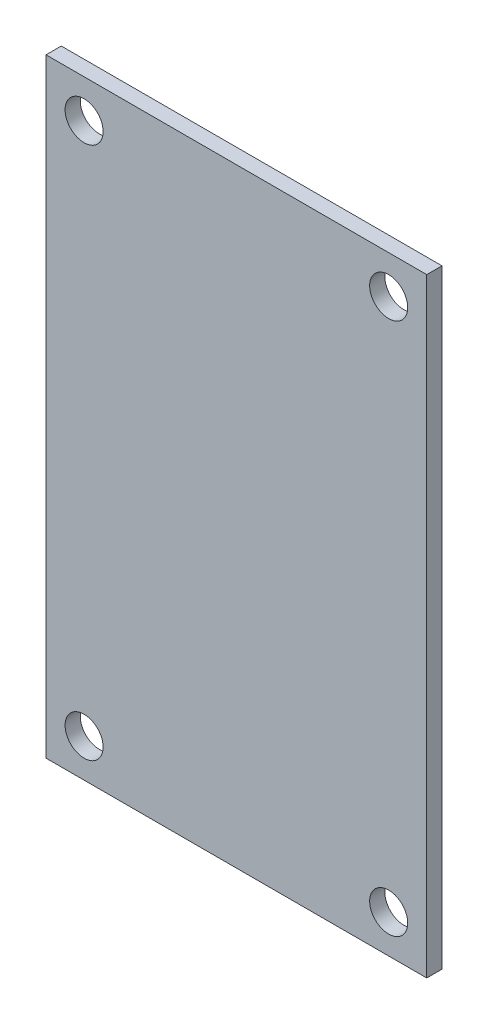
ISO-10303-21;
HEADER;
FILE_DESCRIPTION(('STEP AP214'),'2;1');
FILE_NAME('part.step','',(''),(''),'','','');
FILE_SCHEMA(('AUTOMOTIVE_DESIGN { 1 0 10303 214 1 1 1 1 }'));
ENDSEC;
DATA;
#1=APPLICATION_CONTEXT('core data for automotive mechanical design processes');
#2=APPLICATION_PROTOCOL_DEFINITION('international standard','automotive_design',2000,#1);
#3=PRODUCT_CONTEXT('',#1,'mechanical');
#4=PRODUCT('Part','Part','',(#3));
#5=PRODUCT_RELATED_PRODUCT_CATEGORY('part','',(#4));
#6=PRODUCT_DEFINITION_FORMATION('','',#4);
#7=PRODUCT_DEFINITION_CONTEXT('part definition',#1,'design');
#8=PRODUCT_DEFINITION('design','',#6,#7);
#9=PRODUCT_DEFINITION_SHAPE('','',#8);
#10=(LENGTH_UNIT() NAMED_UNIT(*) SI_UNIT(.MILLI.,.METRE.));
#11=(NAMED_UNIT(*) PLANE_ANGLE_UNIT() SI_UNIT($,.RADIAN.));
#12=(NAMED_UNIT(*) SI_UNIT($,.STERADIAN.) SOLID_ANGLE_UNIT());
#13=UNCERTAINTY_MEASURE_WITH_UNIT(LENGTH_MEASURE(1.E-05),#10,'distance_accuracy_value','');
#14=(GEOMETRIC_REPRESENTATION_CONTEXT(3) GLOBAL_UNCERTAINTY_ASSIGNED_CONTEXT((#13)) GLOBAL_UNIT_ASSIGNED_CONTEXT((#10,
#11,#12)) REPRESENTATION_CONTEXT('',''));
#15=CARTESIAN_POINT('',(0.,0.,0.));
#16=DIRECTION('',(0.,0.,1.));
#17=DIRECTION('',(1.,0.,0.));
#18=AXIS2_PLACEMENT_3D('',#15,#16,#17);
#19=CARTESIAN_POINT('',(0.,0.,0.2));
#20=DIRECTION('',(0.,1.,0.));
#21=DIRECTION('',(-1.,0.,0.));
#22=AXIS2_PLACEMENT_3D('',#19,#20,#21);
#23=PLANE('',#22);
#24=DIRECTION('',(1.,0.,0.));
#25=VECTOR('',#24,1.);
#26=CARTESIAN_POINT('',(0.,0.,0.));
#27=LINE('',#26,#25);
#28=CARTESIAN_POINT('',(0.,0.,0.));
#29=VERTEX_POINT('',#28);
#30=CARTESIAN_POINT('',(5.,0.,0.));
#31=VERTEX_POINT('',#30);
#32=EDGE_CURVE('E114',#29,#31,#27,.T.);
#33=ORIENTED_EDGE('',*,*,#32,.T.);
#34=DIRECTION('',(0.,0.,-1.));
#35=VECTOR('',#34,1.);
#36=CARTESIAN_POINT('',(5.,0.,0.2));
#37=LINE('',#36,#35);
#38=CARTESIAN_POINT('',(5.,0.,0.2));
#39=VERTEX_POINT('',#38);
#40=EDGE_CURVE('E11',#39,#31,#37,.T.);
#41=ORIENTED_EDGE('',*,*,#40,.F.);
#42=DIRECTION('',(1.,0.,0.));
#43=VECTOR('',#42,1.);
#44=CARTESIAN_POINT('',(0.,0.,0.2));
#45=LINE('',#44,#43);
#46=CARTESIAN_POINT('',(0.,0.,0.2));
#47=VERTEX_POINT('',#46);
#48=EDGE_CURVE('E88',#47,#39,#45,.T.);
#49=ORIENTED_EDGE('',*,*,#48,.F.);
#50=DIRECTION('',(0.,0.,-1.));
#51=VECTOR('',#50,1.);
#52=CARTESIAN_POINT('',(0.,0.,0.2));
#53=LINE('',#52,#51);
#54=EDGE_CURVE('E54',#47,#29,#53,.T.);
#55=ORIENTED_EDGE('',*,*,#54,.T.);
#56=EDGE_LOOP('',(#33,#41,#49,#55));
#57=FACE_BOUND('',#56,.T.);
#58=ADVANCED_FACE('F37',(#57),#23,.F.);
#59=CARTESIAN_POINT('',(5.,0.,0.2));
#60=DIRECTION('',(-1.,0.,0.));
#61=DIRECTION('',(0.,0.,1.));
#62=AXIS2_PLACEMENT_3D('',#59,#60,#61);
#63=PLANE('',#62);
#64=DIRECTION('',(0.,1.,0.));
#65=VECTOR('',#64,1.);
#66=CARTESIAN_POINT('',(5.,0.,0.));
#67=LINE('',#66,#65);
#68=CARTESIAN_POINT('',(5.,8.,0.));
#69=VERTEX_POINT('',#68);
#70=EDGE_CURVE('E93',#31,#69,#67,.T.);
#71=ORIENTED_EDGE('',*,*,#70,.T.);
#72=DIRECTION('',(0.,0.,-1.));
#73=VECTOR('',#72,1.);
#74=CARTESIAN_POINT('',(5.,8.,0.2));
#75=LINE('',#74,#73);
#76=CARTESIAN_POINT('',(5.,8.,0.2));
#77=VERTEX_POINT('',#76);
#78=EDGE_CURVE('E46',#77,#69,#75,.T.);
#79=ORIENTED_EDGE('',*,*,#78,.F.);
#80=DIRECTION('',(0.,1.,0.));
#81=VECTOR('',#80,1.);
#82=CARTESIAN_POINT('',(5.,0.,0.2));
#83=LINE('',#82,#81);
#84=EDGE_CURVE('E79',#39,#77,#83,.T.);
#85=ORIENTED_EDGE('',*,*,#84,.F.);
#86=ORIENTED_EDGE('',*,*,#40,.T.);
#87=EDGE_LOOP('',(#71,#79,#85,#86));
#88=FACE_BOUND('',#87,.T.);
#89=ADVANCED_FACE('F92',(#88),#63,.F.);
#90=CARTESIAN_POINT('',(0.,8.,0.2));
#91=DIRECTION('',(0.,1.,0.));
#92=DIRECTION('',(0.,0.,1.));
#93=AXIS2_PLACEMENT_3D('',#90,#91,#92);
#94=PLANE('',#93);
#95=DIRECTION('',(1.,0.,0.));
#96=VECTOR('',#95,1.);
#97=CARTESIAN_POINT('',(0.,8.,0.));
#98=LINE('',#97,#96);
#99=CARTESIAN_POINT('',(0.,8.,0.));
#100=VERTEX_POINT('',#99);
#101=EDGE_CURVE('E117',#100,#69,#98,.T.);
#102=ORIENTED_EDGE('',*,*,#101,.F.);
#103=DIRECTION('',(0.,0.,-1.));
#104=VECTOR('',#103,1.);
#105=CARTESIAN_POINT('',(0.,8.,0.2));
#106=LINE('',#105,#104);
#107=CARTESIAN_POINT('',(0.,8.,0.2));
#108=VERTEX_POINT('',#107);
#109=EDGE_CURVE('E68',#108,#100,#106,.T.);
#110=ORIENTED_EDGE('',*,*,#109,.F.);
#111=DIRECTION('',(1.,0.,0.));
#112=VECTOR('',#111,1.);
#113=CARTESIAN_POINT('',(0.,8.,0.2));
#114=LINE('',#113,#112);
#115=EDGE_CURVE('E87',#108,#77,#114,.T.);
#116=ORIENTED_EDGE('',*,*,#115,.T.);
#117=ORIENTED_EDGE('',*,*,#78,.T.);
#118=EDGE_LOOP('',(#102,#110,#116,#117));
#119=FACE_BOUND('',#118,.T.);
#120=ADVANCED_FACE('F96',(#119),#94,.T.);
#121=CARTESIAN_POINT('',(0.,0.,0.2));
#122=DIRECTION('',(-1.,0.,0.));
#123=DIRECTION('',(0.,-1.,0.));
#124=AXIS2_PLACEMENT_3D('',#121,#122,#123);
#125=PLANE('',#124);
#126=DIRECTION('',(0.,1.,0.));
#127=VECTOR('',#126,1.);
#128=CARTESIAN_POINT('',(0.,0.,0.));
#129=LINE('',#128,#127);
#130=EDGE_CURVE('E119',#29,#100,#129,.T.);
#131=ORIENTED_EDGE('',*,*,#130,.F.);
#132=ORIENTED_EDGE('',*,*,#54,.F.);
#133=DIRECTION('',(0.,1.,0.));
#134=VECTOR('',#133,1.);
#135=CARTESIAN_POINT('',(0.,0.,0.2));
#136=LINE('',#135,#134);
#137=EDGE_CURVE('E97',#47,#108,#136,.T.);
#138=ORIENTED_EDGE('',*,*,#137,.T.);
#139=ORIENTED_EDGE('',*,*,#109,.T.);
#140=EDGE_LOOP('',(#131,#132,#138,#139));
#141=FACE_BOUND('',#140,.T.);
#142=ADVANCED_FACE('F167',(#141),#125,.T.);
#143=CARTESIAN_POINT('',(4.5,0.500000000000001,0.2));
#144=DIRECTION('',(0.,0.,-1.));
#145=DIRECTION('',(-1.,0.,0.));
#146=AXIS2_PLACEMENT_3D('',#143,#144,#145);
#147=CYLINDRICAL_SURFACE('',#146,0.25);
#148=CARTESIAN_POINT('',(4.5,0.500000000000001,0.2));
#149=DIRECTION('',(0.,0.,1.));
#150=DIRECTION('',(1.,0.,0.));
#151=AXIS2_PLACEMENT_3D('',#148,#149,#150);
#152=CIRCLE('',#151,0.25);
#153=CARTESIAN_POINT('',(4.75,0.500000000000001,0.2));
#154=VERTEX_POINT('',#153);
#155=EDGE_CURVE('E135',#154,#154,#152,.T.);
#156=ORIENTED_EDGE('',*,*,#155,.T.);
#157=EDGE_LOOP('',(#156));
#158=FACE_BOUND('',#157,.T.);
#159=CARTESIAN_POINT('',(4.5,0.500000000000001,0.));
#160=DIRECTION('',(0.,0.,1.));
#161=DIRECTION('',(1.,0.,0.));
#162=AXIS2_PLACEMENT_3D('',#159,#160,#161);
#163=CIRCLE('',#162,0.25);
#164=CARTESIAN_POINT('',(4.75,0.500000000000001,0.));
#165=VERTEX_POINT('',#164);
#166=EDGE_CURVE('E111',#165,#165,#163,.T.);
#167=ORIENTED_EDGE('',*,*,#166,.F.);
#168=EDGE_LOOP('',(#167));
#169=FACE_BOUND('',#168,.T.);
#170=ADVANCED_FACE('F141',(#158,#169),#147,.F.);
#171=CARTESIAN_POINT('',(4.5,7.5,0.2));
#172=DIRECTION('',(0.,0.,-1.));
#173=DIRECTION('',(-1.,0.,0.));
#174=AXIS2_PLACEMENT_3D('',#171,#172,#173);
#175=CYLINDRICAL_SURFACE('',#174,0.25);
#176=CARTESIAN_POINT('',(4.5,7.5,0.2));
#177=DIRECTION('',(0.,0.,1.));
#178=DIRECTION('',(1.,0.,0.));
#179=AXIS2_PLACEMENT_3D('',#176,#177,#178);
#180=CIRCLE('',#179,0.25);
#181=CARTESIAN_POINT('',(4.75,7.5,0.2));
#182=VERTEX_POINT('',#181);
#183=EDGE_CURVE('E130',#182,#182,#180,.T.);
#184=ORIENTED_EDGE('',*,*,#183,.T.);
#185=EDGE_LOOP('',(#184));
#186=FACE_BOUND('',#185,.T.);
#187=CARTESIAN_POINT('',(4.5,7.5,0.));
#188=DIRECTION('',(0.,0.,1.));
#189=DIRECTION('',(1.,0.,0.));
#190=AXIS2_PLACEMENT_3D('',#187,#188,#189);
#191=CIRCLE('',#190,0.25);
#192=CARTESIAN_POINT('',(4.75,7.5,0.));
#193=VERTEX_POINT('',#192);
#194=EDGE_CURVE('E108',#193,#193,#191,.T.);
#195=ORIENTED_EDGE('',*,*,#194,.F.);
#196=EDGE_LOOP('',(#195));
#197=FACE_BOUND('',#196,.T.);
#198=ADVANCED_FACE('F166',(#186,#197),#175,.F.);
#199=CARTESIAN_POINT('',(0.5,0.5,0.2));
#200=DIRECTION('',(0.,0.,-1.));
#201=DIRECTION('',(-1.,0.,0.));
#202=AXIS2_PLACEMENT_3D('',#199,#200,#201);
#203=CYLINDRICAL_SURFACE('',#202,0.25);
#204=CARTESIAN_POINT('',(0.5,0.5,0.2));
#205=DIRECTION('',(0.,0.,1.));
#206=DIRECTION('',(1.,0.,0.));
#207=AXIS2_PLACEMENT_3D('',#204,#205,#206);
#208=CIRCLE('',#207,0.25);
#209=CARTESIAN_POINT('',(0.75,0.5,0.2));
#210=VERTEX_POINT('',#209);
#211=EDGE_CURVE('E125',#210,#210,#208,.F.);
#212=ORIENTED_EDGE('',*,*,#211,.F.);
#213=EDGE_LOOP('',(#212));
#214=FACE_BOUND('',#213,.T.);
#215=CARTESIAN_POINT('',(0.5,0.5,0.));
#216=DIRECTION('',(0.,0.,1.));
#217=DIRECTION('',(1.,0.,0.));
#218=AXIS2_PLACEMENT_3D('',#215,#216,#217);
#219=CIRCLE('',#218,0.25);
#220=CARTESIAN_POINT('',(0.75,0.5,0.));
#221=VERTEX_POINT('',#220);
#222=EDGE_CURVE('E105',#221,#221,#219,.F.);
#223=ORIENTED_EDGE('',*,*,#222,.T.);
#224=EDGE_LOOP('',(#223));
#225=FACE_BOUND('',#224,.T.);
#226=ADVANCED_FACE('F39',(#214,#225),#203,.F.);
#227=CARTESIAN_POINT('',(0.499999999999998,7.5,0.2));
#228=DIRECTION('',(0.,0.,-1.));
#229=DIRECTION('',(-1.,0.,0.));
#230=AXIS2_PLACEMENT_3D('',#227,#228,#229);
#231=CYLINDRICAL_SURFACE('',#230,0.25);
#232=CARTESIAN_POINT('',(0.499999999999998,7.5,0.2));
#233=DIRECTION('',(0.,0.,1.));
#234=DIRECTION('',(1.,0.,0.));
#235=AXIS2_PLACEMENT_3D('',#232,#233,#234);
#236=CIRCLE('',#235,0.25);
#237=CARTESIAN_POINT('',(0.749999999999998,7.5,0.2));
#238=VERTEX_POINT('',#237);
#239=EDGE_CURVE('E99',#238,#238,#236,.F.);
#240=ORIENTED_EDGE('',*,*,#239,.F.);
#241=EDGE_LOOP('',(#240));
#242=FACE_BOUND('',#241,.T.);
#243=CARTESIAN_POINT('',(0.499999999999998,7.5,0.));
#244=DIRECTION('',(0.,0.,1.));
#245=DIRECTION('',(1.,0.,0.));
#246=AXIS2_PLACEMENT_3D('',#243,#244,#245);
#247=CIRCLE('',#246,0.25);
#248=CARTESIAN_POINT('',(0.749999999999998,7.5,0.));
#249=VERTEX_POINT('',#248);
#250=EDGE_CURVE('E122',#249,#249,#247,.F.);
#251=ORIENTED_EDGE('',*,*,#250,.T.);
#252=EDGE_LOOP('',(#251));
#253=FACE_BOUND('',#252,.T.);
#254=ADVANCED_FACE('F146',(#242,#253),#231,.F.);
#255=CARTESIAN_POINT('',(0.,0.,0.2));
#256=DIRECTION('',(0.,0.,1.));
#257=DIRECTION('',(1.,0.,0.));
#258=AXIS2_PLACEMENT_3D('',#255,#256,#257);
#259=PLANE('',#258);
#260=ORIENTED_EDGE('',*,*,#211,.T.);
#261=EDGE_LOOP('',(#260));
#262=FACE_BOUND('',#261,.T.);
#263=ORIENTED_EDGE('',*,*,#183,.F.);
#264=EDGE_LOOP('',(#263));
#265=FACE_BOUND('',#264,.T.);
#266=ORIENTED_EDGE('',*,*,#155,.F.);
#267=EDGE_LOOP('',(#266));
#268=FACE_BOUND('',#267,.T.);
#269=ORIENTED_EDGE('',*,*,#48,.T.);
#270=ORIENTED_EDGE('',*,*,#84,.T.);
#271=ORIENTED_EDGE('',*,*,#115,.F.);
#272=ORIENTED_EDGE('',*,*,#137,.F.);
#273=EDGE_LOOP('',(#269,#270,#271,#272));
#274=FACE_BOUND('',#273,.T.);
#275=ORIENTED_EDGE('',*,*,#239,.T.);
#276=EDGE_LOOP('',(#275));
#277=FACE_BOUND('',#276,.T.);
#278=ADVANCED_FACE('F83',(#262,#265,#268,#274,#277),#259,.T.);
#279=CARTESIAN_POINT('',(0.,0.,0.));
#280=DIRECTION('',(0.,0.,1.));
#281=DIRECTION('',(1.,0.,0.));
#282=AXIS2_PLACEMENT_3D('',#279,#280,#281);
#283=PLANE('',#282);
#284=ORIENTED_EDGE('',*,*,#222,.F.);
#285=EDGE_LOOP('',(#284));
#286=FACE_BOUND('',#285,.T.);
#287=ORIENTED_EDGE('',*,*,#194,.T.);
#288=EDGE_LOOP('',(#287));
#289=FACE_BOUND('',#288,.T.);
#290=ORIENTED_EDGE('',*,*,#166,.T.);
#291=EDGE_LOOP('',(#290));
#292=FACE_BOUND('',#291,.T.);
#293=ORIENTED_EDGE('',*,*,#32,.F.);
#294=ORIENTED_EDGE('',*,*,#130,.T.);
#295=ORIENTED_EDGE('',*,*,#101,.T.);
#296=ORIENTED_EDGE('',*,*,#70,.F.);
#297=EDGE_LOOP('',(#293,#294,#295,#296));
#298=FACE_BOUND('',#297,.T.);
#299=ORIENTED_EDGE('',*,*,#250,.F.);
#300=EDGE_LOOP('',(#299));
#301=FACE_BOUND('',#300,.T.);
#302=ADVANCED_FACE('F145',(#286,#289,#292,#298,#301),#283,.F.);
#303=CLOSED_SHELL('',(#58,#89,#120,#142,#170,#198,#226,#254,#278,#302));
#304=MANIFOLD_SOLID_BREP('B2',#303);
#305=ADVANCED_BREP_SHAPE_REPRESENTATION('',(#18,#304),#14);
#306=SHAPE_DEFINITION_REPRESENTATION(#9,#305);
ENDSEC;
END-ISO-10303-21;
